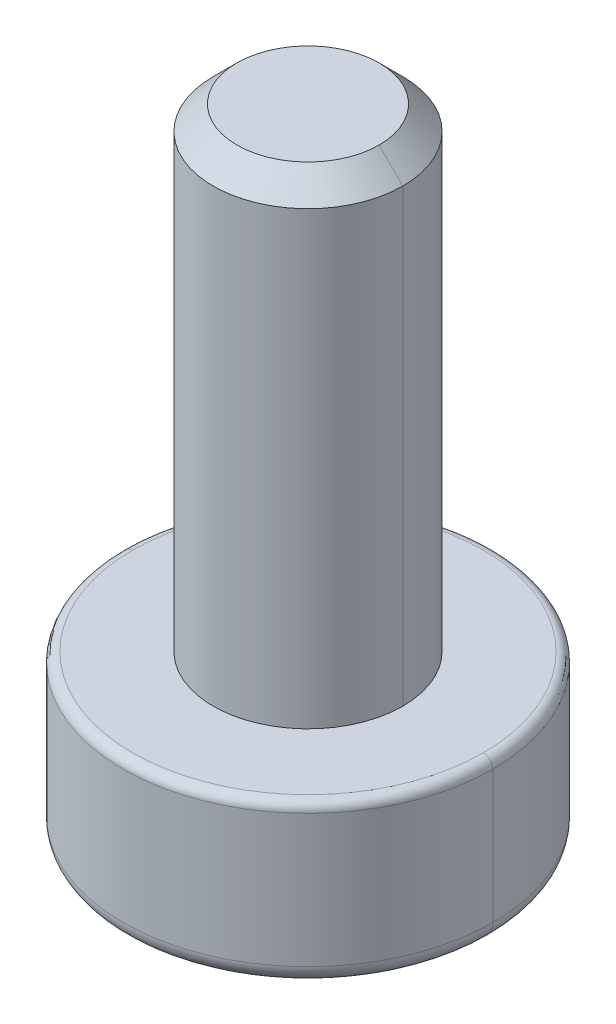
ISO-10303-21;
HEADER;
FILE_DESCRIPTION(('STEP AP214'),'2;1');
FILE_NAME('part.step','',(''),(''),'','','');
FILE_SCHEMA(('AUTOMOTIVE_DESIGN { 1 0 10303 214 1 1 1 1 }'));
ENDSEC;
DATA;
#1=APPLICATION_CONTEXT('core data for automotive mechanical design processes');
#2=APPLICATION_PROTOCOL_DEFINITION('international standard','automotive_design',2000,#1);
#3=PRODUCT_CONTEXT('',#1,'mechanical');
#4=PRODUCT('Part','Part','',(#3));
#5=PRODUCT_RELATED_PRODUCT_CATEGORY('part','',(#4));
#6=PRODUCT_DEFINITION_FORMATION('','',#4);
#7=PRODUCT_DEFINITION_CONTEXT('part definition',#1,'design');
#8=PRODUCT_DEFINITION('design','',#6,#7);
#9=PRODUCT_DEFINITION_SHAPE('','',#8);
#10=(LENGTH_UNIT() NAMED_UNIT(*) SI_UNIT(.MILLI.,.METRE.));
#11=(NAMED_UNIT(*) PLANE_ANGLE_UNIT() SI_UNIT($,.RADIAN.));
#12=(NAMED_UNIT(*) SI_UNIT($,.STERADIAN.) SOLID_ANGLE_UNIT());
#13=UNCERTAINTY_MEASURE_WITH_UNIT(LENGTH_MEASURE(1.E-05),#10,'distance_accuracy_value','');
#14=(GEOMETRIC_REPRESENTATION_CONTEXT(3) GLOBAL_UNCERTAINTY_ASSIGNED_CONTEXT((#13)) GLOBAL_UNIT_ASSIGNED_CONTEXT((#10,
#11,#12)) REPRESENTATION_CONTEXT('',''));
#15=CARTESIAN_POINT('',(0.,0.,0.));
#16=DIRECTION('',(0.,0.,1.));
#17=DIRECTION('',(1.,0.,0.));
#18=AXIS2_PLACEMENT_3D('',#15,#16,#17);
#19=CARTESIAN_POINT('',(0.,6.574999131524,0.));
#20=DIRECTION('',(0.,-1.,0.));
#21=DIRECTION('',(0.,0.,-1.));
#22=AXIS2_PLACEMENT_3D('',#19,#20,#21);
#23=CONICAL_SURFACE('',#22,0.8749991753498,0.785397195896893);
#24=CARTESIAN_POINT('',(0.,6.699999398743,0.));
#25=DIRECTION('',(0.,-1.,0.));
#26=DIRECTION('',(-1.,0.,0.));
#27=AXIS2_PLACEMENT_3D('',#24,#25,#26);
#28=CIRCLE('',#27,0.7499991500067);
#29=CARTESIAN_POINT('',(-0.7499991500067,6.699999398743,0.));
#30=VERTEX_POINT('',#29);
#31=CARTESIAN_POINT('',(0.,6.699999398743,-0.7499991500067));
#32=VERTEX_POINT('',#31);
#33=EDGE_CURVE('E11',#30,#32,#28,.T.);
#34=ORIENTED_EDGE('',*,*,#33,.T.);
#35=DIRECTION('',(0.,-0.70710746531242,-0.707106097060013));
#36=VECTOR('',#35,1.);
#37=CARTESIAN_POINT('',(0.,6.574999131524,-0.8749991753498));
#38=LINE('',#37,#36);
#39=CARTESIAN_POINT('',(0.,6.449998864306,-0.999999200692378));
#40=VERTEX_POINT('',#39);
#41=EDGE_CURVE('E28',#32,#40,#38,.T.);
#42=ORIENTED_EDGE('',*,*,#41,.T.);
#43=CARTESIAN_POINT('',(0.,6.449998864306,0.));
#44=DIRECTION('',(0.,-1.,0.));
#45=DIRECTION('',(-1.,0.,0.));
#46=AXIS2_PLACEMENT_3D('',#43,#44,#45);
#47=CIRCLE('',#46,0.999999200693);
#48=CARTESIAN_POINT('',(-0.9999996003465,6.449998864306,-3.907262195984E-11));
#49=VERTEX_POINT('',#48);
#50=EDGE_CURVE('E383',#49,#40,#47,.T.);
#51=ORIENTED_EDGE('',*,*,#50,.F.);
#52=DIRECTION('',(-0.707106378820633,-0.707107183552233,0.));
#53=VECTOR('',#52,1.);
#54=CARTESIAN_POINT('',(-0.7499991500068,6.699999599162,-3.907266248709E-11));
#55=LINE('',#54,#53);
#56=EDGE_CURVE('E349',#30,#49,#55,.T.);
#57=ORIENTED_EDGE('',*,*,#56,.F.);
#58=EDGE_LOOP('',(#34,#42,#51,#57));
#59=FACE_BOUND('',#58,.T.);
#60=ADVANCED_FACE('F17',(#59),#23,.T.);
#61=CARTESIAN_POINT('',(0.,0.3,0.));
#62=DIRECTION('',(0.,-1.,0.));
#63=DIRECTION('',(0.,0.,-1.));
#64=AXIS2_PLACEMENT_3D('',#61,#62,#63);
#65=PLANE('',#64);
#66=DIRECTION('',(0.,0.,-1.));
#67=VECTOR('',#66,1.);
#68=CARTESIAN_POINT('',(-0.8,0.3,0.2));
#69=LINE('',#68,#67);
#70=CARTESIAN_POINT('',(-0.8,0.3,0.2));
#71=VERTEX_POINT('',#70);
#72=CARTESIAN_POINT('',(-0.8,0.3,-0.2));
#73=VERTEX_POINT('',#72);
#74=EDGE_CURVE('E334',#71,#73,#69,.T.);
#75=ORIENTED_EDGE('',*,*,#74,.T.);
#76=DIRECTION('',(1.,0.,0.));
#77=VECTOR('',#76,1.);
#78=CARTESIAN_POINT('',(-0.8,0.3,-0.2));
#79=LINE('',#78,#77);
#80=CARTESIAN_POINT('',(-0.2,0.3,-0.2));
#81=VERTEX_POINT('',#80);
#82=EDGE_CURVE('E330',#73,#81,#79,.T.);
#83=ORIENTED_EDGE('',*,*,#82,.T.);
#84=DIRECTION('',(0.,0.,-1.));
#85=VECTOR('',#84,1.);
#86=CARTESIAN_POINT('',(-0.2,0.3,-0.2));
#87=LINE('',#86,#85);
#88=CARTESIAN_POINT('',(-0.2,0.3,-0.8));
#89=VERTEX_POINT('',#88);
#90=EDGE_CURVE('E335',#81,#89,#87,.T.);
#91=ORIENTED_EDGE('',*,*,#90,.T.);
#92=DIRECTION('',(1.,0.,0.));
#93=VECTOR('',#92,1.);
#94=CARTESIAN_POINT('',(-0.2,0.3,-0.8));
#95=LINE('',#94,#93);
#96=CARTESIAN_POINT('',(0.2,0.3,-0.8));
#97=VERTEX_POINT('',#96);
#98=EDGE_CURVE('E378',#89,#97,#95,.T.);
#99=ORIENTED_EDGE('',*,*,#98,.T.);
#100=DIRECTION('',(0.,0.,1.));
#101=VECTOR('',#100,1.);
#102=CARTESIAN_POINT('',(0.2,0.3,-0.8));
#103=LINE('',#102,#101);
#104=CARTESIAN_POINT('',(0.2,0.3,-0.2));
#105=VERTEX_POINT('',#104);
#106=EDGE_CURVE('E244',#97,#105,#103,.T.);
#107=ORIENTED_EDGE('',*,*,#106,.T.);
#108=DIRECTION('',(1.,0.,0.));
#109=VECTOR('',#108,1.);
#110=CARTESIAN_POINT('',(0.2,0.3,-0.2));
#111=LINE('',#110,#109);
#112=CARTESIAN_POINT('',(0.8,0.3,-0.2));
#113=VERTEX_POINT('',#112);
#114=EDGE_CURVE('E239',#105,#113,#111,.T.);
#115=ORIENTED_EDGE('',*,*,#114,.T.);
#116=DIRECTION('',(0.,0.,1.));
#117=VECTOR('',#116,1.);
#118=CARTESIAN_POINT('',(0.8,0.3,-0.2));
#119=LINE('',#118,#117);
#120=CARTESIAN_POINT('',(0.8,0.3,0.2));
#121=VERTEX_POINT('',#120);
#122=EDGE_CURVE('E229',#113,#121,#119,.T.);
#123=ORIENTED_EDGE('',*,*,#122,.T.);
#124=DIRECTION('',(-1.,0.,0.));
#125=VECTOR('',#124,1.);
#126=CARTESIAN_POINT('',(0.8,0.3,0.2));
#127=LINE('',#126,#125);
#128=CARTESIAN_POINT('',(0.2,0.3,0.2));
#129=VERTEX_POINT('',#128);
#130=EDGE_CURVE('E221',#121,#129,#127,.T.);
#131=ORIENTED_EDGE('',*,*,#130,.T.);
#132=DIRECTION('',(0.,0.,1.));
#133=VECTOR('',#132,1.);
#134=CARTESIAN_POINT('',(0.2,0.3,0.2));
#135=LINE('',#134,#133);
#136=CARTESIAN_POINT('',(0.2,0.3,0.8));
#137=VERTEX_POINT('',#136);
#138=EDGE_CURVE('E354',#129,#137,#135,.T.);
#139=ORIENTED_EDGE('',*,*,#138,.T.);
#140=DIRECTION('',(-1.,0.,0.));
#141=VECTOR('',#140,1.);
#142=CARTESIAN_POINT('',(0.2,0.3,0.8));
#143=LINE('',#142,#141);
#144=CARTESIAN_POINT('',(-0.2,0.3,0.8));
#145=VERTEX_POINT('',#144);
#146=EDGE_CURVE('E323',#137,#145,#143,.T.);
#147=ORIENTED_EDGE('',*,*,#146,.T.);
#148=DIRECTION('',(0.,0.,-1.));
#149=VECTOR('',#148,1.);
#150=CARTESIAN_POINT('',(-0.2,0.3,0.8));
#151=LINE('',#150,#149);
#152=CARTESIAN_POINT('',(-0.2,0.3,0.2));
#153=VERTEX_POINT('',#152);
#154=EDGE_CURVE('E320',#145,#153,#151,.T.);
#155=ORIENTED_EDGE('',*,*,#154,.T.);
#156=DIRECTION('',(-1.,0.,0.));
#157=VECTOR('',#156,1.);
#158=CARTESIAN_POINT('',(-0.2,0.3,0.2));
#159=LINE('',#158,#157);
#160=EDGE_CURVE('E324',#153,#71,#159,.T.);
#161=ORIENTED_EDGE('',*,*,#160,.T.);
#162=EDGE_LOOP('',(#75,#83,#91,#99,#107,#115,#123,#131,#139,#147,#155,#161));
#163=FACE_BOUND('',#162,.T.);
#164=ADVANCED_FACE('F19',(#163),#65,.T.);
#165=CARTESIAN_POINT('',(0.2,0.,-0.8));
#166=DIRECTION('',(1.,0.,0.));
#167=DIRECTION('',(0.,1.,0.));
#168=AXIS2_PLACEMENT_3D('',#165,#166,#167);
#169=PLANE('',#168);
#170=DIRECTION('',(0.,-1.,0.));
#171=VECTOR('',#170,1.);
#172=CARTESIAN_POINT('',(0.2,0.3,-0.2));
#173=LINE('',#172,#171);
#174=CARTESIAN_POINT('',(0.2,0.,-0.2));
#175=VERTEX_POINT('',#174);
#176=EDGE_CURVE('E254',#105,#175,#173,.T.);
#177=ORIENTED_EDGE('',*,*,#176,.F.);
#178=ORIENTED_EDGE('',*,*,#106,.F.);
#179=DIRECTION('',(0.,1.,0.));
#180=VECTOR('',#179,1.);
#181=CARTESIAN_POINT('',(0.2,0.,-0.8));
#182=LINE('',#181,#180);
#183=CARTESIAN_POINT('',(0.2,0.,-0.8));
#184=VERTEX_POINT('',#183);
#185=EDGE_CURVE('E297',#184,#97,#182,.T.);
#186=ORIENTED_EDGE('',*,*,#185,.F.);
#187=DIRECTION('',(0.,0.,1.));
#188=VECTOR('',#187,1.);
#189=CARTESIAN_POINT('',(0.2,0.,-0.8));
#190=LINE('',#189,#188);
#191=EDGE_CURVE('E261',#184,#175,#190,.T.);
#192=ORIENTED_EDGE('',*,*,#191,.T.);
#193=EDGE_LOOP('',(#177,#178,#186,#192));
#194=FACE_BOUND('',#193,.T.);
#195=ADVANCED_FACE('F508',(#194),#169,.F.);
#196=CARTESIAN_POINT('',(-0.8,0.,-0.2));
#197=DIRECTION('',(0.,0.,-1.));
#198=DIRECTION('',(0.,-1.,0.));
#199=AXIS2_PLACEMENT_3D('',#196,#197,#198);
#200=PLANE('',#199);
#201=DIRECTION('',(1.,0.,0.));
#202=VECTOR('',#201,1.);
#203=CARTESIAN_POINT('',(0.2,0.,-0.2));
#204=LINE('',#203,#202);
#205=CARTESIAN_POINT('',(0.8,0.,-0.2));
#206=VERTEX_POINT('',#205);
#207=EDGE_CURVE('E251',#175,#206,#204,.T.);
#208=ORIENTED_EDGE('',*,*,#207,.T.);
#209=DIRECTION('',(0.,1.,0.));
#210=VECTOR('',#209,1.);
#211=CARTESIAN_POINT('',(0.8,0.,-0.2));
#212=LINE('',#211,#210);
#213=EDGE_CURVE('E234',#206,#113,#212,.T.);
#214=ORIENTED_EDGE('',*,*,#213,.T.);
#215=ORIENTED_EDGE('',*,*,#114,.F.);
#216=ORIENTED_EDGE('',*,*,#176,.T.);
#217=EDGE_LOOP('',(#208,#214,#215,#216));
#218=FACE_BOUND('',#217,.T.);
#219=ADVANCED_FACE('F249',(#218),#200,.F.);
#220=CARTESIAN_POINT('',(0.8,0.,-0.2));
#221=DIRECTION('',(1.,0.,0.));
#222=DIRECTION('',(0.,1.,0.));
#223=AXIS2_PLACEMENT_3D('',#220,#221,#222);
#224=PLANE('',#223);
#225=DIRECTION('',(0.,1.,0.));
#226=VECTOR('',#225,1.);
#227=CARTESIAN_POINT('',(0.8,0.,0.2));
#228=LINE('',#227,#226);
#229=CARTESIAN_POINT('',(0.8,0.,0.2));
#230=VERTEX_POINT('',#229);
#231=EDGE_CURVE('E236',#230,#121,#228,.T.);
#232=ORIENTED_EDGE('',*,*,#231,.T.);
#233=ORIENTED_EDGE('',*,*,#122,.F.);
#234=ORIENTED_EDGE('',*,*,#213,.F.);
#235=DIRECTION('',(0.,0.,1.));
#236=VECTOR('',#235,1.);
#237=CARTESIAN_POINT('',(0.8,0.,-0.2));
#238=LINE('',#237,#236);
#239=EDGE_CURVE('E313',#206,#230,#238,.T.);
#240=ORIENTED_EDGE('',*,*,#239,.T.);
#241=EDGE_LOOP('',(#232,#233,#234,#240));
#242=FACE_BOUND('',#241,.T.);
#243=ADVANCED_FACE('F231',(#242),#224,.F.);
#244=CARTESIAN_POINT('',(0.8,0.,0.2));
#245=DIRECTION('',(0.,0.,1.));
#246=DIRECTION('',(1.,0.,0.));
#247=AXIS2_PLACEMENT_3D('',#244,#245,#246);
#248=PLANE('',#247);
#249=ORIENTED_EDGE('',*,*,#130,.F.);
#250=ORIENTED_EDGE('',*,*,#231,.F.);
#251=DIRECTION('',(-1.,0.,0.));
#252=VECTOR('',#251,1.);
#253=CARTESIAN_POINT('',(0.8,0.,0.2));
#254=LINE('',#253,#252);
#255=CARTESIAN_POINT('',(0.2,0.,0.2));
#256=VERTEX_POINT('',#255);
#257=EDGE_CURVE('E316',#230,#256,#254,.T.);
#258=ORIENTED_EDGE('',*,*,#257,.T.);
#259=DIRECTION('',(0.,-1.,0.));
#260=VECTOR('',#259,1.);
#261=CARTESIAN_POINT('',(0.2,0.3,0.2));
#262=LINE('',#261,#260);
#263=EDGE_CURVE('E421',#129,#256,#262,.T.);
#264=ORIENTED_EDGE('',*,*,#263,.F.);
#265=EDGE_LOOP('',(#249,#250,#258,#264));
#266=FACE_BOUND('',#265,.T.);
#267=ADVANCED_FACE('F590',(#266),#248,.F.);
#268=CARTESIAN_POINT('',(0.2,0.,-0.8));
#269=DIRECTION('',(1.,0.,0.));
#270=DIRECTION('',(0.,1.,0.));
#271=AXIS2_PLACEMENT_3D('',#268,#269,#270);
#272=PLANE('',#271);
#273=DIRECTION('',(0.,1.,0.));
#274=VECTOR('',#273,1.);
#275=CARTESIAN_POINT('',(0.2,0.,0.8));
#276=LINE('',#275,#274);
#277=CARTESIAN_POINT('',(0.2,0.,0.8));
#278=VERTEX_POINT('',#277);
#279=EDGE_CURVE('E397',#278,#137,#276,.T.);
#280=ORIENTED_EDGE('',*,*,#279,.T.);
#281=ORIENTED_EDGE('',*,*,#138,.F.);
#282=ORIENTED_EDGE('',*,*,#263,.T.);
#283=DIRECTION('',(0.,0.,1.));
#284=VECTOR('',#283,1.);
#285=CARTESIAN_POINT('',(0.2,0.,0.2));
#286=LINE('',#285,#284);
#287=EDGE_CURVE('E408',#256,#278,#286,.T.);
#288=ORIENTED_EDGE('',*,*,#287,.T.);
#289=EDGE_LOOP('',(#280,#281,#282,#288));
#290=FACE_BOUND('',#289,.T.);
#291=ADVANCED_FACE('F453',(#290),#272,.F.);
#292=CARTESIAN_POINT('',(0.2,0.,0.8));
#293=DIRECTION('',(0.,0.,1.));
#294=DIRECTION('',(1.,0.,0.));
#295=AXIS2_PLACEMENT_3D('',#292,#293,#294);
#296=PLANE('',#295);
#297=DIRECTION('',(0.,1.,0.));
#298=VECTOR('',#297,1.);
#299=CARTESIAN_POINT('',(-0.2,0.,0.8));
#300=LINE('',#299,#298);
#301=CARTESIAN_POINT('',(-0.2,0.,0.8));
#302=VERTEX_POINT('',#301);
#303=EDGE_CURVE('E304',#302,#145,#300,.T.);
#304=ORIENTED_EDGE('',*,*,#303,.T.);
#305=ORIENTED_EDGE('',*,*,#146,.F.);
#306=ORIENTED_EDGE('',*,*,#279,.F.);
#307=DIRECTION('',(-1.,0.,0.));
#308=VECTOR('',#307,1.);
#309=CARTESIAN_POINT('',(0.2,0.,0.8));
#310=LINE('',#309,#308);
#311=EDGE_CURVE('E301',#278,#302,#310,.T.);
#312=ORIENTED_EDGE('',*,*,#311,.T.);
#313=EDGE_LOOP('',(#304,#305,#306,#312));
#314=FACE_BOUND('',#313,.T.);
#315=ADVANCED_FACE('F458',(#314),#296,.F.);
#316=CARTESIAN_POINT('',(-0.2,0.,0.8));
#317=DIRECTION('',(-1.,0.,0.));
#318=DIRECTION('',(0.,0.,1.));
#319=AXIS2_PLACEMENT_3D('',#316,#317,#318);
#320=PLANE('',#319);
#321=DIRECTION('',(0.,-1.,0.));
#322=VECTOR('',#321,1.);
#323=CARTESIAN_POINT('',(-0.2,0.3,0.2));
#324=LINE('',#323,#322);
#325=CARTESIAN_POINT('',(-0.2,0.,0.2));
#326=VERTEX_POINT('',#325);
#327=EDGE_CURVE('E277',#153,#326,#324,.T.);
#328=ORIENTED_EDGE('',*,*,#327,.F.);
#329=ORIENTED_EDGE('',*,*,#154,.F.);
#330=ORIENTED_EDGE('',*,*,#303,.F.);
#331=DIRECTION('',(0.,0.,-1.));
#332=VECTOR('',#331,1.);
#333=CARTESIAN_POINT('',(-0.2,0.,0.8));
#334=LINE('',#333,#332);
#335=EDGE_CURVE('E21',#302,#326,#334,.T.);
#336=ORIENTED_EDGE('',*,*,#335,.T.);
#337=EDGE_LOOP('',(#328,#329,#330,#336));
#338=FACE_BOUND('',#337,.T.);
#339=ADVANCED_FACE('F648',(#338),#320,.F.);
#340=CARTESIAN_POINT('',(0.8,0.,0.2));
#341=DIRECTION('',(0.,0.,1.));
#342=DIRECTION('',(1.,0.,0.));
#343=AXIS2_PLACEMENT_3D('',#340,#341,#342);
#344=PLANE('',#343);
#345=DIRECTION('',(-1.,0.,0.));
#346=VECTOR('',#345,1.);
#347=CARTESIAN_POINT('',(-0.2,0.,0.2));
#348=LINE('',#347,#346);
#349=CARTESIAN_POINT('',(-0.8,0.,0.2));
#350=VERTEX_POINT('',#349);
#351=EDGE_CURVE('E276',#326,#350,#348,.T.);
#352=ORIENTED_EDGE('',*,*,#351,.T.);
#353=DIRECTION('',(0.,1.,0.));
#354=VECTOR('',#353,1.);
#355=CARTESIAN_POINT('',(-0.8,0.,0.2));
#356=LINE('',#355,#354);
#357=EDGE_CURVE('E187',#350,#71,#356,.T.);
#358=ORIENTED_EDGE('',*,*,#357,.T.);
#359=ORIENTED_EDGE('',*,*,#160,.F.);
#360=ORIENTED_EDGE('',*,*,#327,.T.);
#361=EDGE_LOOP('',(#352,#358,#359,#360));
#362=FACE_BOUND('',#361,.T.);
#363=ADVANCED_FACE('F643',(#362),#344,.F.);
#364=CARTESIAN_POINT('',(-0.8,0.,0.2));
#365=DIRECTION('',(-1.,0.,0.));
#366=DIRECTION('',(0.,0.,1.));
#367=AXIS2_PLACEMENT_3D('',#364,#365,#366);
#368=PLANE('',#367);
#369=DIRECTION('',(0.,1.,0.));
#370=VECTOR('',#369,1.);
#371=CARTESIAN_POINT('',(-0.8,0.,-0.2));
#372=LINE('',#371,#370);
#373=CARTESIAN_POINT('',(-0.8,0.,-0.2));
#374=VERTEX_POINT('',#373);
#375=EDGE_CURVE('E300',#374,#73,#372,.T.);
#376=ORIENTED_EDGE('',*,*,#375,.T.);
#377=ORIENTED_EDGE('',*,*,#74,.F.);
#378=ORIENTED_EDGE('',*,*,#357,.F.);
#379=DIRECTION('',(0.,0.,-1.));
#380=VECTOR('',#379,1.);
#381=CARTESIAN_POINT('',(-0.8,0.,0.2));
#382=LINE('',#381,#380);
#383=EDGE_CURVE('E195',#350,#374,#382,.T.);
#384=ORIENTED_EDGE('',*,*,#383,.T.);
#385=EDGE_LOOP('',(#376,#377,#378,#384));
#386=FACE_BOUND('',#385,.T.);
#387=ADVANCED_FACE('F601',(#386),#368,.F.);
#388=CARTESIAN_POINT('',(-0.8,0.,-0.2));
#389=DIRECTION('',(0.,0.,-1.));
#390=DIRECTION('',(0.,-1.,0.));
#391=AXIS2_PLACEMENT_3D('',#388,#389,#390);
#392=PLANE('',#391);
#393=ORIENTED_EDGE('',*,*,#82,.F.);
#394=ORIENTED_EDGE('',*,*,#375,.F.);
#395=DIRECTION('',(1.,0.,0.));
#396=VECTOR('',#395,1.);
#397=CARTESIAN_POINT('',(-0.8,0.,-0.2));
#398=LINE('',#397,#396);
#399=CARTESIAN_POINT('',(-0.2,0.,-0.2));
#400=VERTEX_POINT('',#399);
#401=EDGE_CURVE('E272',#374,#400,#398,.T.);
#402=ORIENTED_EDGE('',*,*,#401,.T.);
#403=DIRECTION('',(0.,-1.,0.));
#404=VECTOR('',#403,1.);
#405=CARTESIAN_POINT('',(-0.2,0.3,-0.2));
#406=LINE('',#405,#404);
#407=EDGE_CURVE('E273',#81,#400,#406,.T.);
#408=ORIENTED_EDGE('',*,*,#407,.F.);
#409=EDGE_LOOP('',(#393,#394,#402,#408));
#410=FACE_BOUND('',#409,.T.);
#411=ADVANCED_FACE('F538',(#410),#392,.F.);
#412=CARTESIAN_POINT('',(-0.2,0.,0.8));
#413=DIRECTION('',(-1.,0.,0.));
#414=DIRECTION('',(0.,0.,1.));
#415=AXIS2_PLACEMENT_3D('',#412,#413,#414);
#416=PLANE('',#415);
#417=DIRECTION('',(0.,1.,0.));
#418=VECTOR('',#417,1.);
#419=CARTESIAN_POINT('',(-0.2,0.,-0.8));
#420=LINE('',#419,#418);
#421=CARTESIAN_POINT('',(-0.2,0.,-0.8));
#422=VERTEX_POINT('',#421);
#423=EDGE_CURVE('E269',#422,#89,#420,.T.);
#424=ORIENTED_EDGE('',*,*,#423,.T.);
#425=ORIENTED_EDGE('',*,*,#90,.F.);
#426=ORIENTED_EDGE('',*,*,#407,.T.);
#427=DIRECTION('',(0.,0.,-1.));
#428=VECTOR('',#427,1.);
#429=CARTESIAN_POINT('',(-0.2,0.,-0.2));
#430=LINE('',#429,#428);
#431=EDGE_CURVE('E294',#400,#422,#430,.T.);
#432=ORIENTED_EDGE('',*,*,#431,.T.);
#433=EDGE_LOOP('',(#424,#425,#426,#432));
#434=FACE_BOUND('',#433,.T.);
#435=ADVANCED_FACE('F533',(#434),#416,.F.);
#436=CARTESIAN_POINT('',(-0.2,0.,-0.8));
#437=DIRECTION('',(0.,0.,-1.));
#438=DIRECTION('',(0.,-1.,0.));
#439=AXIS2_PLACEMENT_3D('',#436,#437,#438);
#440=PLANE('',#439);
#441=ORIENTED_EDGE('',*,*,#185,.T.);
#442=ORIENTED_EDGE('',*,*,#98,.F.);
#443=ORIENTED_EDGE('',*,*,#423,.F.);
#444=DIRECTION('',(1.,0.,0.));
#445=VECTOR('',#444,1.);
#446=CARTESIAN_POINT('',(-0.2,0.,-0.8));
#447=LINE('',#446,#445);
#448=EDGE_CURVE('E358',#422,#184,#447,.T.);
#449=ORIENTED_EDGE('',*,*,#448,.T.);
#450=EDGE_LOOP('',(#441,#442,#443,#449));
#451=FACE_BOUND('',#450,.T.);
#452=ADVANCED_FACE('F481',(#451),#440,.F.);
#453=CARTESIAN_POINT('',(0.,6.574999131524,0.));
#454=DIRECTION('',(0.,-1.,0.));
#455=DIRECTION('',(0.,0.,-1.));
#456=AXIS2_PLACEMENT_3D('',#453,#454,#455);
#457=CONICAL_SURFACE('',#456,0.8749991753498,0.785397195896893);
#458=ORIENTED_EDGE('',*,*,#56,.T.);
#459=CARTESIAN_POINT('',(0.,6.449998864306,0.));
#460=DIRECTION('',(0.,-1.,0.));
#461=DIRECTION('',(1.,0.,6.885413316573E-11));
#462=AXIS2_PLACEMENT_3D('',#459,#460,#461);
#463=CIRCLE('',#462,0.999999200693);
#464=CARTESIAN_POINT('',(0.999999200693,6.449998864306,6.885407813014E-11));
#465=VERTEX_POINT('',#464);
#466=EDGE_CURVE('E362',#465,#49,#463,.T.);
#467=ORIENTED_EDGE('',*,*,#466,.F.);
#468=DIRECTION('',(0.707106378820633,-0.707107183552233,9.73742846253946E-11));
#469=VECTOR('',#468,1.);
#470=CARTESIAN_POINT('',(0.7499991500068,6.699999599162,4.746571699658E-11));
#471=LINE('',#470,#469);
#472=CARTESIAN_POINT('',(0.7499991500067,6.699999398743,0.));
#473=VERTEX_POINT('',#472);
#474=EDGE_CURVE('E390',#473,#465,#471,.T.);
#475=ORIENTED_EDGE('',*,*,#474,.F.);
#476=CARTESIAN_POINT('',(0.,6.699999398743,0.));
#477=DIRECTION('',(0.,-1.,0.));
#478=DIRECTION('',(0.,0.,1.));
#479=AXIS2_PLACEMENT_3D('',#476,#477,#478);
#480=CIRCLE('',#479,0.7499991500067);
#481=EDGE_CURVE('E345',#473,#30,#480,.T.);
#482=ORIENTED_EDGE('',*,*,#481,.T.);
#483=EDGE_LOOP('',(#458,#467,#475,#482));
#484=FACE_BOUND('',#483,.T.);
#485=ADVANCED_FACE('F475',(#484),#457,.T.);
#486=CARTESIAN_POINT('',(0.,6.7,0.));
#487=DIRECTION('',(0.,-1.,0.));
#488=DIRECTION('',(0.,0.,-1.));
#489=AXIS2_PLACEMENT_3D('',#486,#487,#488);
#490=PLANE('',#489);
#491=ORIENTED_EDGE('',*,*,#481,.F.);
#492=CARTESIAN_POINT('',(0.,6.699999398743,0.));
#493=DIRECTION('',(0.,-1.,0.));
#494=DIRECTION('',(-1.,0.,0.));
#495=AXIS2_PLACEMENT_3D('',#492,#493,#494);
#496=CIRCLE('',#495,0.7499991500067);
#497=EDGE_CURVE('E350',#32,#473,#496,.T.);
#498=ORIENTED_EDGE('',*,*,#497,.F.);
#499=ORIENTED_EDGE('',*,*,#33,.F.);
#500=EDGE_LOOP('',(#491,#498,#499));
#501=FACE_BOUND('',#500,.T.);
#502=ADVANCED_FACE('F480',(#501),#490,.F.);
#503=CARTESIAN_POINT('',(0.,6.574999131524,0.));
#504=DIRECTION('',(0.,-1.,0.));
#505=DIRECTION('',(0.,0.,-1.));
#506=AXIS2_PLACEMENT_3D('',#503,#504,#505);
#507=CONICAL_SURFACE('',#506,0.8749991753498,0.785397195896893);
#508=ORIENTED_EDGE('',*,*,#41,.F.);
#509=ORIENTED_EDGE('',*,*,#497,.T.);
#510=ORIENTED_EDGE('',*,*,#474,.T.);
#511=CARTESIAN_POINT('',(0.,6.449998864306,0.));
#512=DIRECTION('',(0.,-1.,0.));
#513=DIRECTION('',(-1.,0.,0.));
#514=AXIS2_PLACEMENT_3D('',#511,#512,#513);
#515=CIRCLE('',#514,0.999999200693);
#516=EDGE_CURVE('E379',#40,#465,#515,.T.);
#517=ORIENTED_EDGE('',*,*,#516,.F.);
#518=EDGE_LOOP('',(#508,#509,#510,#517));
#519=FACE_BOUND('',#518,.T.);
#520=ADVANCED_FACE('F547',(#519),#507,.T.);
#521=CARTESIAN_POINT('',(0.,7.035,0.));
#522=DIRECTION('',(0.,-1.,0.));
#523=DIRECTION('',(-1.,0.,0.));
#524=AXIS2_PLACEMENT_3D('',#521,#522,#523);
#525=CYLINDRICAL_SURFACE('',#524,1.);
#526=DIRECTION('',(8.41375982377691E-08,1.,-8.22582999465491E-12));
#527=VECTOR('',#526,1.);
#528=CARTESIAN_POINT('',(-1.,1.7,0.));
#529=LINE('',#528,#527);
#530=CARTESIAN_POINT('',(-1.,1.7,0.));
#531=VERTEX_POINT('',#530);
#532=EDGE_CURVE('E415',#531,#49,#529,.T.);
#533=ORIENTED_EDGE('',*,*,#532,.T.);
#534=ORIENTED_EDGE('',*,*,#50,.T.);
#535=ORIENTED_EDGE('',*,*,#516,.T.);
#536=DIRECTION('',(-8.41375982377691E-08,1.,7.57685047973891E-12));
#537=VECTOR('',#536,1.);
#538=CARTESIAN_POINT('',(1.,1.7,4.59027759142E-11));
#539=LINE('',#538,#537);
#540=CARTESIAN_POINT('',(1.,1.7,0.));
#541=VERTEX_POINT('',#540);
#542=EDGE_CURVE('E365',#541,#465,#539,.T.);
#543=ORIENTED_EDGE('',*,*,#542,.F.);
#544=CARTESIAN_POINT('',(0.,1.7,0.));
#545=DIRECTION('',(0.,1.,0.));
#546=DIRECTION('',(1.,0.,0.));
#547=AXIS2_PLACEMENT_3D('',#544,#545,#546);
#548=CIRCLE('',#547,1.);
#549=EDGE_CURVE('E384',#541,#531,#548,.T.);
#550=ORIENTED_EDGE('',*,*,#549,.T.);
#551=EDGE_LOOP('',(#533,#534,#535,#543,#550));
#552=FACE_BOUND('',#551,.T.);
#553=ADVANCED_FACE('F552',(#552),#525,.T.);
#554=CARTESIAN_POINT('',(0.,7.035,0.));
#555=DIRECTION('',(0.,-1.,0.));
#556=DIRECTION('',(-1.,0.,0.));
#557=AXIS2_PLACEMENT_3D('',#554,#555,#556);
#558=CYLINDRICAL_SURFACE('',#557,1.);
#559=ORIENTED_EDGE('',*,*,#542,.T.);
#560=ORIENTED_EDGE('',*,*,#466,.T.);
#561=ORIENTED_EDGE('',*,*,#532,.F.);
#562=CARTESIAN_POINT('',(0.,1.7,0.));
#563=DIRECTION('',(0.,1.,0.));
#564=DIRECTION('',(-1.,0.,0.));
#565=AXIS2_PLACEMENT_3D('',#562,#563,#564);
#566=CIRCLE('',#565,1.);
#567=EDGE_CURVE('E366',#531,#541,#566,.T.);
#568=ORIENTED_EDGE('',*,*,#567,.T.);
#569=EDGE_LOOP('',(#559,#560,#561,#568));
#570=FACE_BOUND('',#569,.T.);
#571=ADVANCED_FACE('F498',(#570),#558,.T.);
#572=CARTESIAN_POINT('',(0.,1.7,0.));
#573=DIRECTION('',(0.,-1.,0.));
#574=DIRECTION('',(0.,0.,-1.));
#575=AXIS2_PLACEMENT_3D('',#572,#573,#574);
#576=PLANE('',#575);
#577=CARTESIAN_POINT('',(0.,1.7,0.));
#578=DIRECTION('',(0.,-1.,0.));
#579=DIRECTION('',(1.,0.,0.));
#580=AXIS2_PLACEMENT_3D('',#577,#578,#579);
#581=CIRCLE('',#580,1.85);
#582=CARTESIAN_POINT('',(1.85,1.7,0.));
#583=VERTEX_POINT('',#582);
#584=CARTESIAN_POINT('',(-1.85,1.7,4.908365380807E-13));
#585=VERTEX_POINT('',#584);
#586=EDGE_CURVE('E308',#583,#585,#581,.T.);
#587=ORIENTED_EDGE('',*,*,#586,.F.);
#588=CARTESIAN_POINT('',(0.,1.7,0.));
#589=DIRECTION('',(0.,-1.,0.));
#590=DIRECTION('',(-1.,0.,0.));
#591=AXIS2_PLACEMENT_3D('',#588,#589,#590);
#592=CIRCLE('',#591,1.85);
#593=EDGE_CURVE('E278',#585,#583,#592,.T.);
#594=ORIENTED_EDGE('',*,*,#593,.F.);
#595=EDGE_LOOP('',(#587,#594));
#596=FACE_BOUND('',#595,.T.);
#597=ORIENTED_EDGE('',*,*,#549,.F.);
#598=ORIENTED_EDGE('',*,*,#567,.F.);
#599=EDGE_LOOP('',(#597,#598));
#600=FACE_BOUND('',#599,.T.);
#601=ADVANCED_FACE('F492',(#596,#600),#576,.F.);
#602=CARTESIAN_POINT('',(0.,1.6,0.));
#603=DIRECTION('',(0.,-1.,0.));
#604=DIRECTION('',(-0.99997427468392,0.,0.00717286347061114));
#605=AXIS2_PLACEMENT_3D('',#602,#603,#604);
#606=TOROIDAL_SURFACE('',#605,1.85,0.1);
#607=CARTESIAN_POINT('',(-1.85,1.6,4.908365380807E-13));
#608=DIRECTION('',(-2.653172820333E-13,0.,-1.));
#609=DIRECTION('',(-1.,0.,2.653172820333E-13));
#610=AXIS2_PLACEMENT_3D('',#607,#608,#609);
#611=CIRCLE('',#610,0.1);
#612=CARTESIAN_POINT('',(-1.95,1.6,0.));
#613=VERTEX_POINT('',#612);
#614=EDGE_CURVE('E282',#613,#585,#611,.T.);
#615=ORIENTED_EDGE('',*,*,#614,.T.);
#616=ORIENTED_EDGE('',*,*,#593,.T.);
#617=CARTESIAN_POINT('',(1.85,1.6,-4.916587970083E-13));
#618=DIRECTION('',(2.657605038814E-13,0.,1.));
#619=DIRECTION('',(1.,0.,-2.657605038814E-13));
#620=AXIS2_PLACEMENT_3D('',#617,#618,#619);
#621=CIRCLE('',#620,0.1);
#622=CARTESIAN_POINT('',(1.95,1.6,-3.814013014779E-13));
#623=VERTEX_POINT('',#622);
#624=EDGE_CURVE('E283',#623,#583,#621,.T.);
#625=ORIENTED_EDGE('',*,*,#624,.F.);
#626=CARTESIAN_POINT('',(0.,1.6,0.));
#627=DIRECTION('',(0.,-1.,0.));
#628=DIRECTION('',(-1.,0.,0.));
#629=AXIS2_PLACEMENT_3D('',#626,#627,#628);
#630=CIRCLE('',#629,1.95);
#631=EDGE_CURVE('E288',#613,#623,#630,.T.);
#632=ORIENTED_EDGE('',*,*,#631,.F.);
#633=EDGE_LOOP('',(#615,#616,#625,#632));
#634=FACE_BOUND('',#633,.T.);
#635=ADVANCED_FACE('F497',(#634),#606,.T.);
#636=CARTESIAN_POINT('',(0.,1.6,0.));
#637=DIRECTION('',(0.,-1.,0.));
#638=DIRECTION('',(0.99997427468392,0.,-0.00717286347061114));
#639=AXIS2_PLACEMENT_3D('',#636,#637,#638);
#640=TOROIDAL_SURFACE('',#639,1.85,0.1);
#641=ORIENTED_EDGE('',*,*,#624,.T.);
#642=ORIENTED_EDGE('',*,*,#586,.T.);
#643=ORIENTED_EDGE('',*,*,#614,.F.);
#644=CARTESIAN_POINT('',(0.,1.6,0.));
#645=DIRECTION('',(0.,-1.,0.));
#646=DIRECTION('',(1.,0.,-1.257997110675E-13));
#647=AXIS2_PLACEMENT_3D('',#644,#645,#646);
#648=CIRCLE('',#647,1.95);
#649=EDGE_CURVE('E361',#623,#613,#648,.T.);
#650=ORIENTED_EDGE('',*,*,#649,.F.);
#651=EDGE_LOOP('',(#641,#642,#643,#650));
#652=FACE_BOUND('',#651,.T.);
#653=ADVANCED_FACE('F576',(#652),#640,.T.);
#654=CARTESIAN_POINT('',(0.,1.785,0.));
#655=DIRECTION('',(0.,-1.,0.));
#656=DIRECTION('',(-1.,0.,0.));
#657=AXIS2_PLACEMENT_3D('',#654,#655,#656);
#658=CYLINDRICAL_SURFACE('',#657,1.95);
#659=DIRECTION('',(0.,-1.,1.848989091795E-13));
#660=VECTOR('',#659,1.);
#661=CARTESIAN_POINT('',(1.95,1.6,-3.814013014779E-13));
#662=LINE('',#661,#660);
#663=CARTESIAN_POINT('',(1.95,0.2,-2.453107161848E-13));
#664=VERTEX_POINT('',#663);
#665=EDGE_CURVE('E267',#623,#664,#662,.T.);
#666=ORIENTED_EDGE('',*,*,#665,.F.);
#667=ORIENTED_EDGE('',*,*,#649,.T.);
#668=DIRECTION('',(0.,-1.,-1.846383908861E-13));
#669=VECTOR('',#668,1.);
#670=CARTESIAN_POINT('',(-1.95,1.6,2.585012606392E-13));
#671=LINE('',#670,#669);
#672=CARTESIAN_POINT('',(-1.95,0.2,0.));
#673=VERTEX_POINT('',#672);
#674=EDGE_CURVE('E312',#613,#673,#671,.T.);
#675=ORIENTED_EDGE('',*,*,#674,.T.);
#676=CARTESIAN_POINT('',(0.,0.2,0.));
#677=DIRECTION('',(0.,1.,0.));
#678=DIRECTION('',(-0.999976587436948,0.,0.00684284867262233));
#679=AXIS2_PLACEMENT_3D('',#676,#677,#678);
#680=CIRCLE('',#679,1.95);
#681=EDGE_CURVE('E291',#673,#664,#680,.T.);
#682=ORIENTED_EDGE('',*,*,#681,.T.);
#683=EDGE_LOOP('',(#666,#667,#675,#682));
#684=FACE_BOUND('',#683,.T.);
#685=ADVANCED_FACE('F570',(#684),#658,.T.);
#686=CARTESIAN_POINT('',(0.,1.785,0.));
#687=DIRECTION('',(0.,-1.,0.));
#688=DIRECTION('',(-1.,0.,0.));
#689=AXIS2_PLACEMENT_3D('',#686,#687,#688);
#690=CYLINDRICAL_SURFACE('',#689,1.95);
#691=ORIENTED_EDGE('',*,*,#674,.F.);
#692=ORIENTED_EDGE('',*,*,#631,.T.);
#693=ORIENTED_EDGE('',*,*,#665,.T.);
#694=CARTESIAN_POINT('',(0.,0.2,0.));
#695=DIRECTION('',(0.,1.,0.));
#696=DIRECTION('',(0.999976587436948,0.,-0.00684284867262133));
#697=AXIS2_PLACEMENT_3D('',#694,#695,#696);
#698=CIRCLE('',#697,1.95);
#699=EDGE_CURVE('E155',#664,#673,#698,.T.);
#700=ORIENTED_EDGE('',*,*,#699,.T.);
#701=EDGE_LOOP('',(#691,#692,#693,#700));
#702=FACE_BOUND('',#701,.T.);
#703=ADVANCED_FACE('F575',(#702),#690,.T.);
#704=CARTESIAN_POINT('',(0.,0.2,0.));
#705=DIRECTION('',(0.,-1.,0.));
#706=DIRECTION('',(-0.999976587436948,0.,0.00684284867262233));
#707=AXIS2_PLACEMENT_3D('',#704,#705,#706);
#708=TOROIDAL_SURFACE('',#707,1.75,0.2);
#709=CARTESIAN_POINT('',(-1.75,0.2,0.));
#710=DIRECTION('',(0.,0.,-1.));
#711=DIRECTION('',(0.,-1.,0.));
#712=AXIS2_PLACEMENT_3D('',#709,#710,#711);
#713=CIRCLE('',#712,0.2);
#714=CARTESIAN_POINT('',(-1.75,0.,0.));
#715=VERTEX_POINT('',#714);
#716=EDGE_CURVE('E284',#715,#673,#713,.T.);
#717=ORIENTED_EDGE('',*,*,#716,.T.);
#718=ORIENTED_EDGE('',*,*,#699,.F.);
#719=CARTESIAN_POINT('',(1.75,0.2,0.));
#720=DIRECTION('',(0.,0.,1.));
#721=DIRECTION('',(0.,-1.,0.));
#722=AXIS2_PLACEMENT_3D('',#719,#720,#721);
#723=CIRCLE('',#722,0.2);
#724=CARTESIAN_POINT('',(1.75,0.,0.));
#725=VERTEX_POINT('',#724);
#726=EDGE_CURVE('E166',#725,#664,#723,.T.);
#727=ORIENTED_EDGE('',*,*,#726,.F.);
#728=CARTESIAN_POINT('',(0.,0.,0.));
#729=DIRECTION('',(0.,1.,0.));
#730=DIRECTION('',(0.999979046943202,0.,-0.00647345924259401));
#731=AXIS2_PLACEMENT_3D('',#728,#729,#730);
#732=CIRCLE('',#731,1.75);
#733=EDGE_CURVE('E287',#725,#715,#732,.T.);
#734=ORIENTED_EDGE('',*,*,#733,.T.);
#735=EDGE_LOOP('',(#717,#718,#727,#734));
#736=FACE_BOUND('',#735,.T.);
#737=ADVANCED_FACE('F708',(#736),#708,.T.);
#738=CARTESIAN_POINT('',(0.,0.2,0.));
#739=DIRECTION('',(0.,-1.,0.));
#740=DIRECTION('',(0.999976587436948,0.,-0.00684284867262233));
#741=AXIS2_PLACEMENT_3D('',#738,#739,#740);
#742=TOROIDAL_SURFACE('',#741,1.75,0.2);
#743=ORIENTED_EDGE('',*,*,#726,.T.);
#744=ORIENTED_EDGE('',*,*,#681,.F.);
#745=ORIENTED_EDGE('',*,*,#716,.F.);
#746=CARTESIAN_POINT('',(0.,0.,0.));
#747=DIRECTION('',(0.,1.,0.));
#748=DIRECTION('',(-0.999979046943202,0.,0.00647345924259401));
#749=AXIS2_PLACEMENT_3D('',#746,#747,#748);
#750=CIRCLE('',#749,1.75);
#751=EDGE_CURVE('E319',#715,#725,#750,.T.);
#752=ORIENTED_EDGE('',*,*,#751,.T.);
#753=EDGE_LOOP('',(#743,#744,#745,#752));
#754=FACE_BOUND('',#753,.T.);
#755=ADVANCED_FACE('F634',(#754),#742,.T.);
#756=CARTESIAN_POINT('',(0.,0.,0.));
#757=DIRECTION('',(0.,-1.,0.));
#758=DIRECTION('',(0.,0.,-1.));
#759=AXIS2_PLACEMENT_3D('',#756,#757,#758);
#760=PLANE('',#759);
#761=ORIENTED_EDGE('',*,*,#733,.F.);
#762=ORIENTED_EDGE('',*,*,#751,.F.);
#763=EDGE_LOOP('',(#761,#762));
#764=FACE_BOUND('',#763,.T.);
#765=ORIENTED_EDGE('',*,*,#431,.F.);
#766=ORIENTED_EDGE('',*,*,#401,.F.);
#767=ORIENTED_EDGE('',*,*,#383,.F.);
#768=ORIENTED_EDGE('',*,*,#351,.F.);
#769=ORIENTED_EDGE('',*,*,#335,.F.);
#770=ORIENTED_EDGE('',*,*,#311,.F.);
#771=ORIENTED_EDGE('',*,*,#287,.F.);
#772=ORIENTED_EDGE('',*,*,#257,.F.);
#773=ORIENTED_EDGE('',*,*,#239,.F.);
#774=ORIENTED_EDGE('',*,*,#207,.F.);
#775=ORIENTED_EDGE('',*,*,#191,.F.);
#776=ORIENTED_EDGE('',*,*,#448,.F.);
#777=EDGE_LOOP('',(#765,#766,#767,#768,#769,#770,#771,#772,#773,#774,#775,#776));
#778=FACE_BOUND('',#777,.T.);
#779=ADVANCED_FACE('F462',(#764,#778),#760,.T.);
#780=CLOSED_SHELL('',(#60,#164,#195,#219,#243,#267,#291,#315,#339,#363,#387,#411,#435,#452,#485,
#502,#520,#553,#571,#601,#635,#653,#685,#703,#737,#755,#779));
#781=MANIFOLD_SOLID_BREP('B1',#780);
#782=ADVANCED_BREP_SHAPE_REPRESENTATION('',(#18,#781),#14);
#783=SHAPE_DEFINITION_REPRESENTATION(#9,#782);
ENDSEC;
END-ISO-10303-21;
